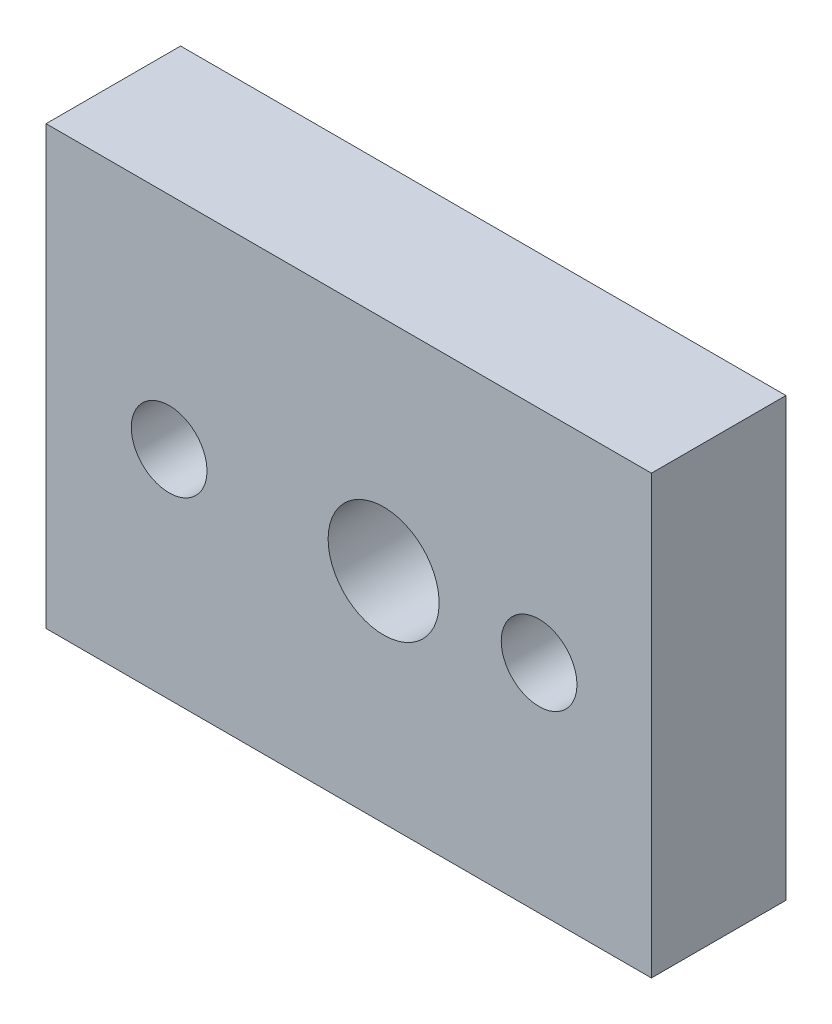
ISO-10303-21;
HEADER;
FILE_DESCRIPTION(('STEP AP214'),'2;1');
FILE_NAME('part.step','',(''),(''),'','','');
FILE_SCHEMA(('AUTOMOTIVE_DESIGN { 1 0 10303 214 1 1 1 1 }'));
ENDSEC;
DATA;
#1=APPLICATION_CONTEXT('core data for automotive mechanical design processes');
#2=APPLICATION_PROTOCOL_DEFINITION('international standard','automotive_design',2000,#1);
#3=PRODUCT_CONTEXT('',#1,'mechanical');
#4=PRODUCT('Part','Part','',(#3));
#5=PRODUCT_RELATED_PRODUCT_CATEGORY('part','',(#4));
#6=PRODUCT_DEFINITION_FORMATION('','',#4);
#7=PRODUCT_DEFINITION_CONTEXT('part definition',#1,'design');
#8=PRODUCT_DEFINITION('design','',#6,#7);
#9=PRODUCT_DEFINITION_SHAPE('','',#8);
#10=(LENGTH_UNIT() NAMED_UNIT(*) SI_UNIT(.MILLI.,.METRE.));
#11=(NAMED_UNIT(*) PLANE_ANGLE_UNIT() SI_UNIT($,.RADIAN.));
#12=(NAMED_UNIT(*) SI_UNIT($,.STERADIAN.) SOLID_ANGLE_UNIT());
#13=UNCERTAINTY_MEASURE_WITH_UNIT(LENGTH_MEASURE(1.E-05),#10,'distance_accuracy_value','');
#14=(GEOMETRIC_REPRESENTATION_CONTEXT(3) GLOBAL_UNCERTAINTY_ASSIGNED_CONTEXT((#13)) GLOBAL_UNIT_ASSIGNED_CONTEXT((#10,
#11,#12)) REPRESENTATION_CONTEXT('',''));
#15=CARTESIAN_POINT('',(0.,0.,0.));
#16=DIRECTION('',(0.,0.,1.));
#17=DIRECTION('',(1.,0.,0.));
#18=AXIS2_PLACEMENT_3D('',#15,#16,#17);
#19=CARTESIAN_POINT('',(18.,-13.,8.));
#20=DIRECTION('',(-1.,0.,0.));
#21=DIRECTION('',(0.,0.,1.));
#22=AXIS2_PLACEMENT_3D('',#19,#20,#21);
#23=PLANE('',#22);
#24=DIRECTION('',(0.,1.,0.));
#25=VECTOR('',#24,1.);
#26=CARTESIAN_POINT('',(18.,-13.,0.));
#27=LINE('',#26,#25);
#28=CARTESIAN_POINT('',(18.,-13.,0.));
#29=VERTEX_POINT('',#28);
#30=CARTESIAN_POINT('',(18.,13.,0.));
#31=VERTEX_POINT('',#30);
#32=EDGE_CURVE('E96',#29,#31,#27,.T.);
#33=ORIENTED_EDGE('',*,*,#32,.T.);
#34=DIRECTION('',(0.,0.,-1.));
#35=VECTOR('',#34,1.);
#36=CARTESIAN_POINT('',(18.,13.,8.));
#37=LINE('',#36,#35);
#38=CARTESIAN_POINT('',(18.,13.,8.));
#39=VERTEX_POINT('',#38);
#40=EDGE_CURVE('E11',#39,#31,#37,.T.);
#41=ORIENTED_EDGE('',*,*,#40,.F.);
#42=DIRECTION('',(0.,1.,0.));
#43=VECTOR('',#42,1.);
#44=CARTESIAN_POINT('',(18.,-13.,8.));
#45=LINE('',#44,#43);
#46=CARTESIAN_POINT('',(18.,-13.,8.));
#47=VERTEX_POINT('',#46);
#48=EDGE_CURVE('E84',#47,#39,#45,.T.);
#49=ORIENTED_EDGE('',*,*,#48,.F.);
#50=DIRECTION('',(0.,0.,-1.));
#51=VECTOR('',#50,1.);
#52=CARTESIAN_POINT('',(18.,-13.,8.));
#53=LINE('',#52,#51);
#54=EDGE_CURVE('E92',#47,#29,#53,.T.);
#55=ORIENTED_EDGE('',*,*,#54,.T.);
#56=EDGE_LOOP('',(#33,#41,#49,#55));
#57=FACE_BOUND('',#56,.T.);
#58=ADVANCED_FACE('F33',(#57),#23,.F.);
#59=CARTESIAN_POINT('',(-18.,13.,8.));
#60=DIRECTION('',(0.,-1.,0.));
#61=DIRECTION('',(0.,0.,-1.));
#62=AXIS2_PLACEMENT_3D('',#59,#60,#61);
#63=PLANE('',#62);
#64=DIRECTION('',(-1.,0.,0.));
#65=VECTOR('',#64,1.);
#66=CARTESIAN_POINT('',(-18.,13.,0.));
#67=LINE('',#66,#65);
#68=CARTESIAN_POINT('',(-18.,13.,0.));
#69=VERTEX_POINT('',#68);
#70=EDGE_CURVE('E88',#31,#69,#67,.T.);
#71=ORIENTED_EDGE('',*,*,#70,.T.);
#72=DIRECTION('',(0.,0.,-1.));
#73=VECTOR('',#72,1.);
#74=CARTESIAN_POINT('',(-18.,13.,8.));
#75=LINE('',#74,#73);
#76=CARTESIAN_POINT('',(-18.,13.,8.));
#77=VERTEX_POINT('',#76);
#78=EDGE_CURVE('E41',#77,#69,#75,.T.);
#79=ORIENTED_EDGE('',*,*,#78,.F.);
#80=DIRECTION('',(-1.,0.,0.));
#81=VECTOR('',#80,1.);
#82=CARTESIAN_POINT('',(-18.,13.,8.));
#83=LINE('',#82,#81);
#84=EDGE_CURVE('E79',#39,#77,#83,.T.);
#85=ORIENTED_EDGE('',*,*,#84,.F.);
#86=ORIENTED_EDGE('',*,*,#40,.T.);
#87=EDGE_LOOP('',(#71,#79,#85,#86));
#88=FACE_BOUND('',#87,.T.);
#89=ADVANCED_FACE('F87',(#88),#63,.F.);
#90=CARTESIAN_POINT('',(-18.,-13.,8.));
#91=DIRECTION('',(1.,0.,0.));
#92=DIRECTION('',(0.,0.,-1.));
#93=AXIS2_PLACEMENT_3D('',#90,#91,#92);
#94=PLANE('',#93);
#95=DIRECTION('',(0.,-1.,0.));
#96=VECTOR('',#95,1.);
#97=CARTESIAN_POINT('',(-18.,-13.,0.));
#98=LINE('',#97,#96);
#99=CARTESIAN_POINT('',(-18.,-13.,0.));
#100=VERTEX_POINT('',#99);
#101=EDGE_CURVE('E66',#69,#100,#98,.T.);
#102=ORIENTED_EDGE('',*,*,#101,.T.);
#103=DIRECTION('',(0.,0.,-1.));
#104=VECTOR('',#103,1.);
#105=CARTESIAN_POINT('',(-18.,-13.,8.));
#106=LINE('',#105,#104);
#107=CARTESIAN_POINT('',(-18.,-13.,8.));
#108=VERTEX_POINT('',#107);
#109=EDGE_CURVE('E89',#108,#100,#106,.T.);
#110=ORIENTED_EDGE('',*,*,#109,.F.);
#111=DIRECTION('',(0.,-1.,0.));
#112=VECTOR('',#111,1.);
#113=CARTESIAN_POINT('',(-18.,-13.,8.));
#114=LINE('',#113,#112);
#115=EDGE_CURVE('E82',#77,#108,#114,.T.);
#116=ORIENTED_EDGE('',*,*,#115,.F.);
#117=ORIENTED_EDGE('',*,*,#78,.T.);
#118=EDGE_LOOP('',(#102,#110,#116,#117));
#119=FACE_BOUND('',#118,.T.);
#120=ADVANCED_FACE('F90',(#119),#94,.F.);
#121=CARTESIAN_POINT('',(-18.,-13.,8.));
#122=DIRECTION('',(0.,1.,0.));
#123=DIRECTION('',(0.,0.,1.));
#124=AXIS2_PLACEMENT_3D('',#121,#122,#123);
#125=PLANE('',#124);
#126=DIRECTION('',(1.,0.,0.));
#127=VECTOR('',#126,1.);
#128=CARTESIAN_POINT('',(-18.,-13.,0.));
#129=LINE('',#128,#127);
#130=EDGE_CURVE('E72',#100,#29,#129,.T.);
#131=ORIENTED_EDGE('',*,*,#130,.T.);
#132=ORIENTED_EDGE('',*,*,#54,.F.);
#133=DIRECTION('',(1.,0.,0.));
#134=VECTOR('',#133,1.);
#135=CARTESIAN_POINT('',(-18.,-13.,8.));
#136=LINE('',#135,#134);
#137=EDGE_CURVE('E49',#108,#47,#136,.T.);
#138=ORIENTED_EDGE('',*,*,#137,.F.);
#139=ORIENTED_EDGE('',*,*,#109,.T.);
#140=EDGE_LOOP('',(#131,#132,#138,#139));
#141=FACE_BOUND('',#140,.T.);
#142=ADVANCED_FACE('F104',(#141),#125,.F.);
#143=CARTESIAN_POINT('',(0.,0.,8.));
#144=DIRECTION('',(0.,0.,-1.));
#145=DIRECTION('',(-1.,0.,0.));
#146=AXIS2_PLACEMENT_3D('',#143,#144,#145);
#147=PLANE('',#146);
#148=CARTESIAN_POINT('',(2.07352645923883,0.,8.));
#149=DIRECTION('',(0.,0.,-1.));
#150=DIRECTION('',(-1.,0.,0.));
#151=AXIS2_PLACEMENT_3D('',#148,#149,#150);
#152=CIRCLE('',#151,3.3);
#153=CARTESIAN_POINT('',(-1.22647354076117,0.,8.));
#154=VERTEX_POINT('',#153);
#155=EDGE_CURVE('E121',#154,#154,#152,.T.);
#156=ORIENTED_EDGE('',*,*,#155,.T.);
#157=EDGE_LOOP('',(#156));
#158=FACE_BOUND('',#157,.T.);
#159=CARTESIAN_POINT('',(11.3188875959707,-0.107841378020033,8.));
#160=DIRECTION('',(0.,0.,-1.));
#161=DIRECTION('',(-1.,0.,0.));
#162=AXIS2_PLACEMENT_3D('',#159,#160,#161);
#163=CIRCLE('',#162,2.25);
#164=CARTESIAN_POINT('',(9.06888759597066,-0.107841378020033,8.));
#165=VERTEX_POINT('',#164);
#166=EDGE_CURVE('E115',#165,#165,#163,.T.);
#167=ORIENTED_EDGE('',*,*,#166,.T.);
#168=EDGE_LOOP('',(#167));
#169=FACE_BOUND('',#168,.T.);
#170=CARTESIAN_POINT('',(-10.681112224082,-0.105027539955879,8.));
#171=DIRECTION('',(0.,0.,-1.));
#172=DIRECTION('',(-1.,0.,0.));
#173=AXIS2_PLACEMENT_3D('',#170,#171,#172);
#174=CIRCLE('',#173,2.25);
#175=CARTESIAN_POINT('',(-12.931112224082,-0.105027539955879,8.));
#176=VERTEX_POINT('',#175);
#177=EDGE_CURVE('E99',#176,#176,#174,.T.);
#178=ORIENTED_EDGE('',*,*,#177,.T.);
#179=EDGE_LOOP('',(#178));
#180=FACE_BOUND('',#179,.T.);
#181=ORIENTED_EDGE('',*,*,#48,.T.);
#182=ORIENTED_EDGE('',*,*,#84,.T.);
#183=ORIENTED_EDGE('',*,*,#115,.T.);
#184=ORIENTED_EDGE('',*,*,#137,.T.);
#185=EDGE_LOOP('',(#181,#182,#183,#184));
#186=FACE_BOUND('',#185,.T.);
#187=ADVANCED_FACE('F80',(#158,#169,#180,#186),#147,.F.);
#188=CARTESIAN_POINT('',(0.,0.,0.));
#189=DIRECTION('',(0.,0.,-1.));
#190=DIRECTION('',(-1.,0.,0.));
#191=AXIS2_PLACEMENT_3D('',#188,#189,#190);
#192=PLANE('',#191);
#193=CARTESIAN_POINT('',(2.07352645923883,0.,0.));
#194=DIRECTION('',(0.,0.,-1.));
#195=DIRECTION('',(-1.,0.,0.));
#196=AXIS2_PLACEMENT_3D('',#193,#194,#195);
#197=CIRCLE('',#196,3.29999999999999);
#198=CARTESIAN_POINT('',(-1.22647354076115,0.,0.));
#199=VERTEX_POINT('',#198);
#200=EDGE_CURVE('E124',#199,#199,#197,.T.);
#201=ORIENTED_EDGE('',*,*,#200,.F.);
#202=EDGE_LOOP('',(#201));
#203=FACE_BOUND('',#202,.T.);
#204=CARTESIAN_POINT('',(11.3188875959707,-0.107841378020033,0.));
#205=DIRECTION('',(0.,0.,-1.));
#206=DIRECTION('',(-1.,0.,0.));
#207=AXIS2_PLACEMENT_3D('',#204,#205,#206);
#208=CIRCLE('',#207,2.25);
#209=CARTESIAN_POINT('',(9.06888759597066,-0.107841378020033,0.));
#210=VERTEX_POINT('',#209);
#211=EDGE_CURVE('E118',#210,#210,#208,.T.);
#212=ORIENTED_EDGE('',*,*,#211,.F.);
#213=EDGE_LOOP('',(#212));
#214=FACE_BOUND('',#213,.T.);
#215=CARTESIAN_POINT('',(-10.681112224082,-0.105027539955879,0.));
#216=DIRECTION('',(0.,0.,-1.));
#217=DIRECTION('',(-1.,0.,0.));
#218=AXIS2_PLACEMENT_3D('',#215,#216,#217);
#219=CIRCLE('',#218,2.25);
#220=CARTESIAN_POINT('',(-12.931112224082,-0.105027539955879,0.));
#221=VERTEX_POINT('',#220);
#222=EDGE_CURVE('E112',#221,#221,#219,.T.);
#223=ORIENTED_EDGE('',*,*,#222,.F.);
#224=EDGE_LOOP('',(#223));
#225=FACE_BOUND('',#224,.T.);
#226=ORIENTED_EDGE('',*,*,#32,.F.);
#227=ORIENTED_EDGE('',*,*,#130,.F.);
#228=ORIENTED_EDGE('',*,*,#101,.F.);
#229=ORIENTED_EDGE('',*,*,#70,.F.);
#230=EDGE_LOOP('',(#226,#227,#228,#229));
#231=FACE_BOUND('',#230,.T.);
#232=ADVANCED_FACE('F107',(#203,#214,#225,#231),#192,.T.);
#233=CARTESIAN_POINT('',(-10.681112224082,-0.105027539955879,0.));
#234=DIRECTION('',(0.,0.,-1.));
#235=DIRECTION('',(-1.,0.,0.));
#236=AXIS2_PLACEMENT_3D('',#233,#234,#235);
#237=CYLINDRICAL_SURFACE('',#236,2.25);
#238=ORIENTED_EDGE('',*,*,#177,.F.);
#239=EDGE_LOOP('',(#238));
#240=FACE_BOUND('',#239,.T.);
#241=ORIENTED_EDGE('',*,*,#222,.T.);
#242=EDGE_LOOP('',(#241));
#243=FACE_BOUND('',#242,.T.);
#244=ADVANCED_FACE('F132',(#240,#243),#237,.F.);
#245=CARTESIAN_POINT('',(11.3188875959707,-0.107841378020033,0.));
#246=DIRECTION('',(0.,0.,-1.));
#247=DIRECTION('',(-1.,0.,0.));
#248=AXIS2_PLACEMENT_3D('',#245,#246,#247);
#249=CYLINDRICAL_SURFACE('',#248,2.25);
#250=ORIENTED_EDGE('',*,*,#166,.F.);
#251=EDGE_LOOP('',(#250));
#252=FACE_BOUND('',#251,.T.);
#253=ORIENTED_EDGE('',*,*,#211,.T.);
#254=EDGE_LOOP('',(#253));
#255=FACE_BOUND('',#254,.T.);
#256=ADVANCED_FACE('F139',(#252,#255),#249,.F.);
#257=CARTESIAN_POINT('',(2.07352645923883,0.,0.));
#258=DIRECTION('',(0.,0.,-1.));
#259=DIRECTION('',(-1.,0.,0.));
#260=AXIS2_PLACEMENT_3D('',#257,#258,#259);
#261=CYLINDRICAL_SURFACE('',#260,3.29999999999999);
#262=ORIENTED_EDGE('',*,*,#155,.F.);
#263=EDGE_LOOP('',(#262));
#264=FACE_BOUND('',#263,.T.);
#265=ORIENTED_EDGE('',*,*,#200,.T.);
#266=EDGE_LOOP('',(#265));
#267=FACE_BOUND('',#266,.T.);
#268=ADVANCED_FACE('F128',(#264,#267),#261,.F.);
#269=CLOSED_SHELL('',(#58,#89,#120,#142,#187,#232,#244,#256,#268));
#270=MANIFOLD_SOLID_BREP('B2',#269);
#271=ADVANCED_BREP_SHAPE_REPRESENTATION('',(#18,#270),#14);
#272=SHAPE_DEFINITION_REPRESENTATION(#9,#271);
ENDSEC;
END-ISO-10303-21;
